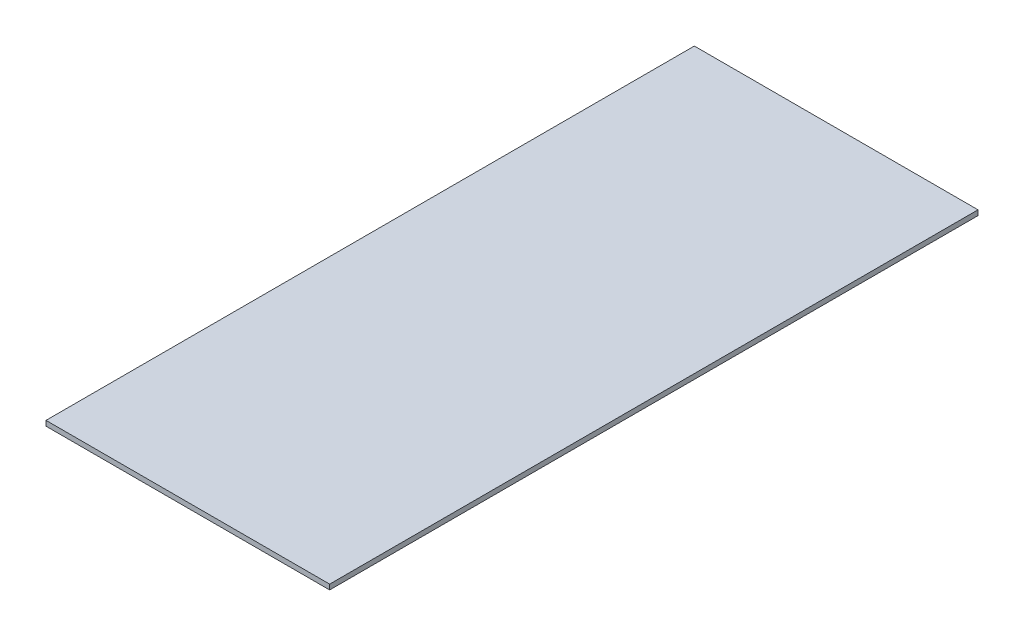
ISO-10303-21;
HEADER;
FILE_DESCRIPTION(('STEP AP214'),'2;1');
FILE_NAME('part.step','',(''),(''),'','','');
FILE_SCHEMA(('AUTOMOTIVE_DESIGN { 1 0 10303 214 1 1 1 1 }'));
ENDSEC;
DATA;
#1=APPLICATION_CONTEXT('core data for automotive mechanical design processes');
#2=APPLICATION_PROTOCOL_DEFINITION('international standard','automotive_design',2000,#1);
#3=PRODUCT_CONTEXT('',#1,'mechanical');
#4=PRODUCT('Part','Part','',(#3));
#5=PRODUCT_RELATED_PRODUCT_CATEGORY('part','',(#4));
#6=PRODUCT_DEFINITION_FORMATION('','',#4);
#7=PRODUCT_DEFINITION_CONTEXT('part definition',#1,'design');
#8=PRODUCT_DEFINITION('design','',#6,#7);
#9=PRODUCT_DEFINITION_SHAPE('','',#8);
#10=(LENGTH_UNIT() NAMED_UNIT(*) SI_UNIT(.MILLI.,.METRE.));
#11=(NAMED_UNIT(*) PLANE_ANGLE_UNIT() SI_UNIT($,.RADIAN.));
#12=(NAMED_UNIT(*) SI_UNIT($,.STERADIAN.) SOLID_ANGLE_UNIT());
#13=UNCERTAINTY_MEASURE_WITH_UNIT(LENGTH_MEASURE(1.E-05),#10,'distance_accuracy_value','');
#14=(GEOMETRIC_REPRESENTATION_CONTEXT(3) GLOBAL_UNCERTAINTY_ASSIGNED_CONTEXT((#13)) GLOBAL_UNIT_ASSIGNED_CONTEXT((#10,
#11,#12)) REPRESENTATION_CONTEXT('',''));
#15=CARTESIAN_POINT('',(0.,0.,0.));
#16=DIRECTION('',(0.,0.,1.));
#17=DIRECTION('',(1.,0.,0.));
#18=AXIS2_PLACEMENT_3D('',#15,#16,#17);
#19=CARTESIAN_POINT('',(88.9,3.175,203.2));
#20=DIRECTION('',(-1.,0.,0.));
#21=DIRECTION('',(0.,0.,1.));
#22=AXIS2_PLACEMENT_3D('',#19,#20,#21);
#23=PLANE('',#22);
#24=DIRECTION('',(0.,0.,-1.));
#25=VECTOR('',#24,1.);
#26=CARTESIAN_POINT('',(88.9,0.,203.2));
#27=LINE('',#26,#25);
#28=CARTESIAN_POINT('',(88.9,0.,203.2));
#29=VERTEX_POINT('',#28);
#30=CARTESIAN_POINT('',(88.9,0.,-203.2));
#31=VERTEX_POINT('',#30);
#32=EDGE_CURVE('E96',#29,#31,#27,.T.);
#33=ORIENTED_EDGE('',*,*,#32,.T.);
#34=DIRECTION('',(0.,-1.,0.));
#35=VECTOR('',#34,1.);
#36=CARTESIAN_POINT('',(88.9,3.175,-203.2));
#37=LINE('',#36,#35);
#38=CARTESIAN_POINT('',(88.9,3.175,-203.2));
#39=VERTEX_POINT('',#38);
#40=EDGE_CURVE('E11',#39,#31,#37,.T.);
#41=ORIENTED_EDGE('',*,*,#40,.F.);
#42=DIRECTION('',(0.,0.,-1.));
#43=VECTOR('',#42,1.);
#44=CARTESIAN_POINT('',(88.9,3.175,203.2));
#45=LINE('',#44,#43);
#46=CARTESIAN_POINT('',(88.9,3.175,203.2));
#47=VERTEX_POINT('',#46);
#48=EDGE_CURVE('E84',#47,#39,#45,.T.);
#49=ORIENTED_EDGE('',*,*,#48,.F.);
#50=DIRECTION('',(0.,-1.,0.));
#51=VECTOR('',#50,1.);
#52=CARTESIAN_POINT('',(88.9,3.175,203.2));
#53=LINE('',#52,#51);
#54=EDGE_CURVE('E92',#47,#29,#53,.T.);
#55=ORIENTED_EDGE('',*,*,#54,.T.);
#56=EDGE_LOOP('',(#33,#41,#49,#55));
#57=FACE_BOUND('',#56,.T.);
#58=ADVANCED_FACE('F33',(#57),#23,.F.);
#59=CARTESIAN_POINT('',(-88.9,3.175,-203.2));
#60=DIRECTION('',(0.,0.,1.));
#61=DIRECTION('',(1.,0.,0.));
#62=AXIS2_PLACEMENT_3D('',#59,#60,#61);
#63=PLANE('',#62);
#64=DIRECTION('',(-1.,0.,0.));
#65=VECTOR('',#64,1.);
#66=CARTESIAN_POINT('',(-88.9,0.,-203.2));
#67=LINE('',#66,#65);
#68=CARTESIAN_POINT('',(-88.9,0.,-203.2));
#69=VERTEX_POINT('',#68);
#70=EDGE_CURVE('E88',#31,#69,#67,.T.);
#71=ORIENTED_EDGE('',*,*,#70,.T.);
#72=DIRECTION('',(0.,-1.,0.));
#73=VECTOR('',#72,1.);
#74=CARTESIAN_POINT('',(-88.9,3.175,-203.2));
#75=LINE('',#74,#73);
#76=CARTESIAN_POINT('',(-88.9,3.175,-203.2));
#77=VERTEX_POINT('',#76);
#78=EDGE_CURVE('E41',#77,#69,#75,.T.);
#79=ORIENTED_EDGE('',*,*,#78,.F.);
#80=DIRECTION('',(-1.,0.,0.));
#81=VECTOR('',#80,1.);
#82=CARTESIAN_POINT('',(-88.9,3.175,-203.2));
#83=LINE('',#82,#81);
#84=EDGE_CURVE('E79',#39,#77,#83,.T.);
#85=ORIENTED_EDGE('',*,*,#84,.F.);
#86=ORIENTED_EDGE('',*,*,#40,.T.);
#87=EDGE_LOOP('',(#71,#79,#85,#86));
#88=FACE_BOUND('',#87,.T.);
#89=ADVANCED_FACE('F87',(#88),#63,.F.);
#90=CARTESIAN_POINT('',(-88.9,3.175,203.2));
#91=DIRECTION('',(1.,0.,0.));
#92=DIRECTION('',(0.,0.,-1.));
#93=AXIS2_PLACEMENT_3D('',#90,#91,#92);
#94=PLANE('',#93);
#95=DIRECTION('',(0.,0.,1.));
#96=VECTOR('',#95,1.);
#97=CARTESIAN_POINT('',(-88.9,0.,203.2));
#98=LINE('',#97,#96);
#99=CARTESIAN_POINT('',(-88.9,0.,203.2));
#100=VERTEX_POINT('',#99);
#101=EDGE_CURVE('E66',#69,#100,#98,.T.);
#102=ORIENTED_EDGE('',*,*,#101,.T.);
#103=DIRECTION('',(0.,-1.,0.));
#104=VECTOR('',#103,1.);
#105=CARTESIAN_POINT('',(-88.9,3.175,203.2));
#106=LINE('',#105,#104);
#107=CARTESIAN_POINT('',(-88.9,3.175,203.2));
#108=VERTEX_POINT('',#107);
#109=EDGE_CURVE('E89',#108,#100,#106,.T.);
#110=ORIENTED_EDGE('',*,*,#109,.F.);
#111=DIRECTION('',(0.,0.,1.));
#112=VECTOR('',#111,1.);
#113=CARTESIAN_POINT('',(-88.9,3.175,203.2));
#114=LINE('',#113,#112);
#115=EDGE_CURVE('E82',#77,#108,#114,.T.);
#116=ORIENTED_EDGE('',*,*,#115,.F.);
#117=ORIENTED_EDGE('',*,*,#78,.T.);
#118=EDGE_LOOP('',(#102,#110,#116,#117));
#119=FACE_BOUND('',#118,.T.);
#120=ADVANCED_FACE('F90',(#119),#94,.F.);
#121=CARTESIAN_POINT('',(-88.9,3.175,203.2));
#122=DIRECTION('',(0.,0.,-1.));
#123=DIRECTION('',(-1.,0.,0.));
#124=AXIS2_PLACEMENT_3D('',#121,#122,#123);
#125=PLANE('',#124);
#126=DIRECTION('',(1.,0.,0.));
#127=VECTOR('',#126,1.);
#128=CARTESIAN_POINT('',(-88.9,0.,203.2));
#129=LINE('',#128,#127);
#130=EDGE_CURVE('E72',#100,#29,#129,.T.);
#131=ORIENTED_EDGE('',*,*,#130,.T.);
#132=ORIENTED_EDGE('',*,*,#54,.F.);
#133=DIRECTION('',(1.,0.,0.));
#134=VECTOR('',#133,1.);
#135=CARTESIAN_POINT('',(-88.9,3.175,203.2));
#136=LINE('',#135,#134);
#137=EDGE_CURVE('E49',#108,#47,#136,.T.);
#138=ORIENTED_EDGE('',*,*,#137,.F.);
#139=ORIENTED_EDGE('',*,*,#109,.T.);
#140=EDGE_LOOP('',(#131,#132,#138,#139));
#141=FACE_BOUND('',#140,.T.);
#142=ADVANCED_FACE('F103',(#141),#125,.F.);
#143=CARTESIAN_POINT('',(0.,3.175,0.));
#144=DIRECTION('',(0.,-1.,0.));
#145=DIRECTION('',(0.,0.,-1.));
#146=AXIS2_PLACEMENT_3D('',#143,#144,#145);
#147=PLANE('',#146);
#148=ORIENTED_EDGE('',*,*,#48,.T.);
#149=ORIENTED_EDGE('',*,*,#84,.T.);
#150=ORIENTED_EDGE('',*,*,#115,.T.);
#151=ORIENTED_EDGE('',*,*,#137,.T.);
#152=EDGE_LOOP('',(#148,#149,#150,#151));
#153=FACE_BOUND('',#152,.T.);
#154=ADVANCED_FACE('F80',(#153),#147,.F.);
#155=CARTESIAN_POINT('',(0.,0.,0.));
#156=DIRECTION('',(0.,-1.,0.));
#157=DIRECTION('',(0.,0.,-1.));
#158=AXIS2_PLACEMENT_3D('',#155,#156,#157);
#159=PLANE('',#158);
#160=ORIENTED_EDGE('',*,*,#32,.F.);
#161=ORIENTED_EDGE('',*,*,#130,.F.);
#162=ORIENTED_EDGE('',*,*,#101,.F.);
#163=ORIENTED_EDGE('',*,*,#70,.F.);
#164=EDGE_LOOP('',(#160,#161,#162,#163));
#165=FACE_BOUND('',#164,.T.);
#166=ADVANCED_FACE('F106',(#165),#159,.T.);
#167=CLOSED_SHELL('',(#58,#89,#120,#142,#154,#166));
#168=MANIFOLD_SOLID_BREP('B2',#167);
#169=ADVANCED_BREP_SHAPE_REPRESENTATION('',(#18,#168),#14);
#170=SHAPE_DEFINITION_REPRESENTATION(#9,#169);
ENDSEC;
END-ISO-10303-21;
